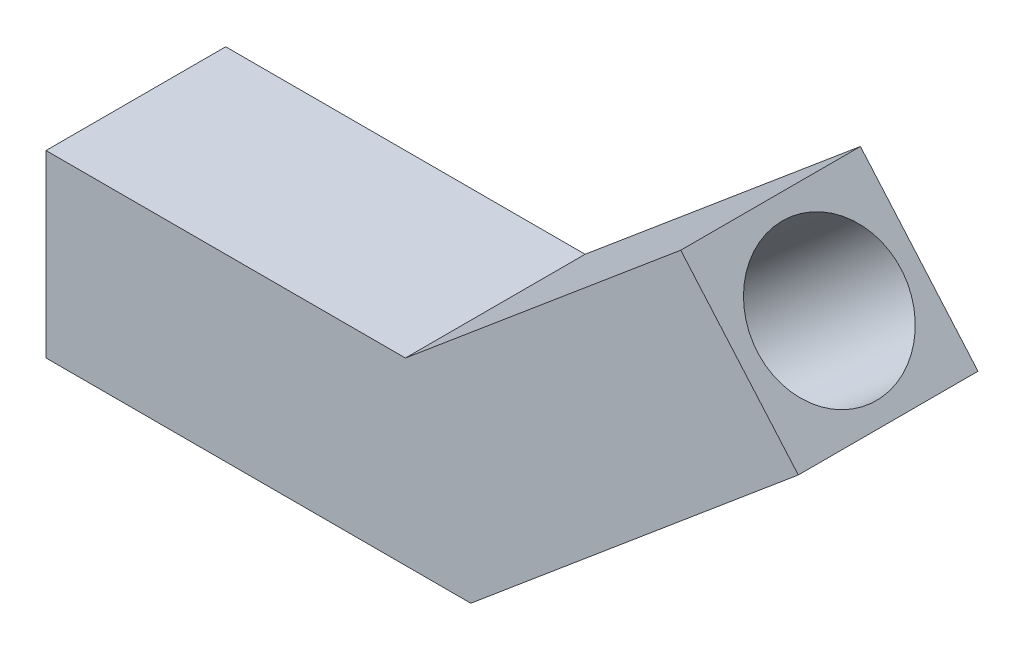
ISO-10303-21;
HEADER;
FILE_DESCRIPTION(('STEP AP214'),'2;1');
FILE_NAME('part.step','',(''),(''),'','','');
FILE_SCHEMA(('AUTOMOTIVE_DESIGN { 1 0 10303 214 1 1 1 1 }'));
ENDSEC;
DATA;
#1=APPLICATION_CONTEXT('core data for automotive mechanical design processes');
#2=APPLICATION_PROTOCOL_DEFINITION('international standard','automotive_design',2000,#1);
#3=PRODUCT_CONTEXT('',#1,'mechanical');
#4=PRODUCT('Part','Part','',(#3));
#5=PRODUCT_RELATED_PRODUCT_CATEGORY('part','',(#4));
#6=PRODUCT_DEFINITION_FORMATION('','',#4);
#7=PRODUCT_DEFINITION_CONTEXT('part definition',#1,'design');
#8=PRODUCT_DEFINITION('design','',#6,#7);
#9=PRODUCT_DEFINITION_SHAPE('','',#8);
#10=(LENGTH_UNIT() NAMED_UNIT(*) SI_UNIT(.MILLI.,.METRE.));
#11=(NAMED_UNIT(*) PLANE_ANGLE_UNIT() SI_UNIT($,.RADIAN.));
#12=(NAMED_UNIT(*) SI_UNIT($,.STERADIAN.) SOLID_ANGLE_UNIT());
#13=UNCERTAINTY_MEASURE_WITH_UNIT(LENGTH_MEASURE(1.E-05),#10,'distance_accuracy_value','');
#14=(GEOMETRIC_REPRESENTATION_CONTEXT(3) GLOBAL_UNCERTAINTY_ASSIGNED_CONTEXT((#13)) GLOBAL_UNIT_ASSIGNED_CONTEXT((#10,
#11,#12)) REPRESENTATION_CONTEXT('',''));
#15=CARTESIAN_POINT('',(0.,0.,0.));
#16=DIRECTION('',(0.,0.,1.));
#17=DIRECTION('',(1.,0.,0.));
#18=AXIS2_PLACEMENT_3D('',#15,#16,#17);
#19=CARTESIAN_POINT('',(-5.,0.,2.5));
#20=DIRECTION('',(1.,0.,0.));
#21=DIRECTION('',(0.,0.,-1.));
#22=AXIS2_PLACEMENT_3D('',#19,#20,#21);
#23=PLANE('',#22);
#24=CARTESIAN_POINT('',(-5.,-1.25,1.25));
#25=DIRECTION('',(-1.,0.,0.));
#26=DIRECTION('',(0.,0.,1.));
#27=AXIS2_PLACEMENT_3D('',#24,#25,#26);
#28=CIRCLE('',#27,1.);
#29=CARTESIAN_POINT('',(-5.,-1.25,2.25));
#30=VERTEX_POINT('',#29);
#31=EDGE_CURVE('E158',#30,#30,#28,.T.);
#32=ORIENTED_EDGE('',*,*,#31,.F.);
#33=EDGE_LOOP('',(#32));
#34=FACE_BOUND('',#33,.T.);
#35=DIRECTION('',(0.,-1.,0.));
#36=VECTOR('',#35,1.);
#37=CARTESIAN_POINT('',(-5.,0.,0.));
#38=LINE('',#37,#36);
#39=CARTESIAN_POINT('',(-5.,0.,0.));
#40=VERTEX_POINT('',#39);
#41=CARTESIAN_POINT('',(-5.,-2.5,0.));
#42=VERTEX_POINT('',#41);
#43=EDGE_CURVE('E116',#40,#42,#38,.T.);
#44=ORIENTED_EDGE('',*,*,#43,.T.);
#45=DIRECTION('',(0.,0.,-1.));
#46=VECTOR('',#45,1.);
#47=CARTESIAN_POINT('',(-5.,-2.5,2.5));
#48=LINE('',#47,#46);
#49=CARTESIAN_POINT('',(-5.,-2.5,2.5));
#50=VERTEX_POINT('',#49);
#51=EDGE_CURVE('E11',#50,#42,#48,.T.);
#52=ORIENTED_EDGE('',*,*,#51,.F.);
#53=DIRECTION('',(0.,-1.,0.));
#54=VECTOR('',#53,1.);
#55=CARTESIAN_POINT('',(-5.,0.,2.5));
#56=LINE('',#55,#54);
#57=CARTESIAN_POINT('',(-5.,0.,2.5));
#58=VERTEX_POINT('',#57);
#59=EDGE_CURVE('E127',#58,#50,#56,.T.);
#60=ORIENTED_EDGE('',*,*,#59,.F.);
#61=DIRECTION('',(0.,0.,-1.));
#62=VECTOR('',#61,1.);
#63=CARTESIAN_POINT('',(-5.,0.,2.5));
#64=LINE('',#63,#62);
#65=EDGE_CURVE('E112',#58,#40,#64,.T.);
#66=ORIENTED_EDGE('',*,*,#65,.T.);
#67=EDGE_LOOP('',(#44,#52,#60,#66));
#68=FACE_BOUND('',#67,.T.);
#69=ADVANCED_FACE('F32',(#34,#68),#23,.F.);
#70=CARTESIAN_POINT('',(-5.,-2.5,2.5));
#71=DIRECTION('',(0.,1.,0.));
#72=DIRECTION('',(0.,0.,1.));
#73=AXIS2_PLACEMENT_3D('',#70,#71,#72);
#74=PLANE('',#73);
#75=DIRECTION('',(1.,0.,0.));
#76=VECTOR('',#75,1.);
#77=CARTESIAN_POINT('',(-5.,-2.5,0.));
#78=LINE('',#77,#76);
#79=CARTESIAN_POINT('',(0.909480398793596,-2.5,0.));
#80=VERTEX_POINT('',#79);
#81=EDGE_CURVE('E119',#42,#80,#78,.T.);
#82=ORIENTED_EDGE('',*,*,#81,.T.);
#83=DIRECTION('',(0.,0.,-1.));
#84=VECTOR('',#83,1.);
#85=CARTESIAN_POINT('',(0.909480398793596,-2.5,2.5));
#86=LINE('',#85,#84);
#87=CARTESIAN_POINT('',(0.909480398793596,-2.5,2.5));
#88=VERTEX_POINT('',#87);
#89=EDGE_CURVE('E40',#88,#80,#86,.T.);
#90=ORIENTED_EDGE('',*,*,#89,.F.);
#91=DIRECTION('',(1.,0.,0.));
#92=VECTOR('',#91,1.);
#93=CARTESIAN_POINT('',(-5.,-2.5,2.5));
#94=LINE('',#93,#92);
#95=EDGE_CURVE('E85',#50,#88,#94,.T.);
#96=ORIENTED_EDGE('',*,*,#95,.F.);
#97=ORIENTED_EDGE('',*,*,#51,.T.);
#98=EDGE_LOOP('',(#82,#90,#96,#97));
#99=FACE_BOUND('',#98,.T.);
#100=ADVANCED_FACE('F151',(#99),#74,.F.);
#101=CARTESIAN_POINT('',(0.909480398793596,-2.5,2.5));
#102=DIRECTION('',(-0.64278760968654,0.766044443118977,0.));
#103=DIRECTION('',(-0.766044443118977,-0.64278760968654,0.));
#104=AXIS2_PLACEMENT_3D('',#101,#102,#103);
#105=PLANE('',#104);
#106=DIRECTION('',(0.766044443118977,0.64278760968654,0.));
#107=VECTOR('',#106,1.);
#108=CARTESIAN_POINT('',(0.909480398793596,-2.5,0.));
#109=LINE('',#108,#107);
#110=CARTESIAN_POINT('',(5.46598283431779,1.32335951310674,0.));
#111=VERTEX_POINT('',#110);
#112=EDGE_CURVE('E122',#80,#111,#109,.T.);
#113=ORIENTED_EDGE('',*,*,#112,.T.);
#114=DIRECTION('',(0.,0.,-1.));
#115=VECTOR('',#114,1.);
#116=CARTESIAN_POINT('',(5.46598283431779,1.32335951310674,2.5));
#117=LINE('',#116,#115);
#118=CARTESIAN_POINT('',(5.46598283431779,1.32335951310674,2.5));
#119=VERTEX_POINT('',#118);
#120=EDGE_CURVE('E107',#119,#111,#117,.T.);
#121=ORIENTED_EDGE('',*,*,#120,.F.);
#122=DIRECTION('',(0.766044443118977,0.64278760968654,0.));
#123=VECTOR('',#122,1.);
#124=CARTESIAN_POINT('',(0.909480398793596,-2.5,2.5));
#125=LINE('',#124,#123);
#126=EDGE_CURVE('E98',#88,#119,#125,.T.);
#127=ORIENTED_EDGE('',*,*,#126,.F.);
#128=ORIENTED_EDGE('',*,*,#89,.T.);
#129=EDGE_LOOP('',(#113,#121,#127,#128));
#130=FACE_BOUND('',#129,.T.);
#131=ADVANCED_FACE('F133',(#130),#105,.F.);
#132=CARTESIAN_POINT('',(5.46598283431779,1.32335951310674,2.5));
#133=DIRECTION('',(-0.756231414130386,-0.65430424748916,0.));
#134=DIRECTION('',(0.65430424748916,-0.756231414130386,0.));
#135=AXIS2_PLACEMENT_3D('',#132,#133,#134);
#136=PLANE('',#135);
#137=CARTESIAN_POINT('',(4.64810252495634,2.26864878076972,1.25));
#138=DIRECTION('',(0.756231414130386,0.654304247489161,0.));
#139=DIRECTION('',(-0.654304247489161,0.756231414130386,0.));
#140=AXIS2_PLACEMENT_3D('',#137,#138,#139);
#141=CIRCLE('',#140,1.);
#142=CARTESIAN_POINT('',(3.99379827746718,3.02488019490011,1.25));
#143=VERTEX_POINT('',#142);
#144=EDGE_CURVE('E163',#143,#143,#141,.T.);
#145=ORIENTED_EDGE('',*,*,#144,.F.);
#146=EDGE_LOOP('',(#145));
#147=FACE_BOUND('',#146,.T.);
#148=DIRECTION('',(-0.65430424748916,0.756231414130386,0.));
#149=VECTOR('',#148,1.);
#150=CARTESIAN_POINT('',(5.46598283431779,1.32335951310674,0.));
#151=LINE('',#150,#149);
#152=CARTESIAN_POINT('',(3.83022221559489,3.2139380484327,0.));
#153=VERTEX_POINT('',#152);
#154=EDGE_CURVE('E106',#111,#153,#151,.T.);
#155=ORIENTED_EDGE('',*,*,#154,.T.);
#156=DIRECTION('',(0.,0.,-1.));
#157=VECTOR('',#156,1.);
#158=CARTESIAN_POINT('',(3.83022221559489,3.2139380484327,2.5));
#159=LINE('',#158,#157);
#160=CARTESIAN_POINT('',(3.83022221559489,3.2139380484327,2.5));
#161=VERTEX_POINT('',#160);
#162=EDGE_CURVE('E103',#161,#153,#159,.T.);
#163=ORIENTED_EDGE('',*,*,#162,.F.);
#164=DIRECTION('',(-0.65430424748916,0.756231414130386,0.));
#165=VECTOR('',#164,1.);
#166=CARTESIAN_POINT('',(5.46598283431779,1.32335951310674,2.5));
#167=LINE('',#166,#165);
#168=EDGE_CURVE('E92',#119,#161,#167,.T.);
#169=ORIENTED_EDGE('',*,*,#168,.F.);
#170=ORIENTED_EDGE('',*,*,#120,.T.);
#171=EDGE_LOOP('',(#155,#163,#169,#170));
#172=FACE_BOUND('',#171,.T.);
#173=ADVANCED_FACE('F104',(#147,#172),#136,.F.);
#174=CARTESIAN_POINT('',(0.,0.,2.5));
#175=DIRECTION('',(0.64278760968654,-0.766044443118977,0.));
#176=DIRECTION('',(0.766044443118977,0.64278760968654,0.));
#177=AXIS2_PLACEMENT_3D('',#174,#175,#176);
#178=PLANE('',#177);
#179=DIRECTION('',(-0.766044443118977,-0.64278760968654,0.));
#180=VECTOR('',#179,1.);
#181=CARTESIAN_POINT('',(0.,0.,0.));
#182=LINE('',#181,#180);
#183=CARTESIAN_POINT('',(0.,0.,0.));
#184=VERTEX_POINT('',#183);
#185=EDGE_CURVE('E71',#153,#184,#182,.T.);
#186=ORIENTED_EDGE('',*,*,#185,.T.);
#187=DIRECTION('',(0.,0.,-1.));
#188=VECTOR('',#187,1.);
#189=CARTESIAN_POINT('',(0.,0.,2.5));
#190=LINE('',#189,#188);
#191=CARTESIAN_POINT('',(0.,0.,2.5));
#192=VERTEX_POINT('',#191);
#193=EDGE_CURVE('E108',#192,#184,#190,.T.);
#194=ORIENTED_EDGE('',*,*,#193,.F.);
#195=DIRECTION('',(-0.766044443118977,-0.64278760968654,0.));
#196=VECTOR('',#195,1.);
#197=CARTESIAN_POINT('',(0.,0.,2.5));
#198=LINE('',#197,#196);
#199=EDGE_CURVE('E96',#161,#192,#198,.T.);
#200=ORIENTED_EDGE('',*,*,#199,.F.);
#201=ORIENTED_EDGE('',*,*,#162,.T.);
#202=EDGE_LOOP('',(#186,#194,#200,#201));
#203=FACE_BOUND('',#202,.T.);
#204=ADVANCED_FACE('F110',(#203),#178,.F.);
#205=CARTESIAN_POINT('',(-5.,0.,2.5));
#206=DIRECTION('',(0.,-1.,0.));
#207=DIRECTION('',(0.,0.,-1.));
#208=AXIS2_PLACEMENT_3D('',#205,#206,#207);
#209=PLANE('',#208);
#210=DIRECTION('',(-1.,0.,0.));
#211=VECTOR('',#210,1.);
#212=CARTESIAN_POINT('',(-5.,0.,0.));
#213=LINE('',#212,#211);
#214=EDGE_CURVE('E77',#184,#40,#213,.T.);
#215=ORIENTED_EDGE('',*,*,#214,.T.);
#216=ORIENTED_EDGE('',*,*,#65,.F.);
#217=DIRECTION('',(-1.,0.,0.));
#218=VECTOR('',#217,1.);
#219=CARTESIAN_POINT('',(-5.,0.,2.5));
#220=LINE('',#219,#218);
#221=EDGE_CURVE('E48',#192,#58,#220,.T.);
#222=ORIENTED_EDGE('',*,*,#221,.F.);
#223=ORIENTED_EDGE('',*,*,#193,.T.);
#224=EDGE_LOOP('',(#215,#216,#222,#223));
#225=FACE_BOUND('',#224,.T.);
#226=ADVANCED_FACE('F140',(#225),#209,.F.);
#227=CARTESIAN_POINT('',(0.,0.,2.5));
#228=DIRECTION('',(0.,0.,1.));
#229=DIRECTION('',(1.,0.,0.));
#230=AXIS2_PLACEMENT_3D('',#227,#228,#229);
#231=PLANE('',#230);
#232=ORIENTED_EDGE('',*,*,#59,.T.);
#233=ORIENTED_EDGE('',*,*,#95,.T.);
#234=ORIENTED_EDGE('',*,*,#126,.T.);
#235=ORIENTED_EDGE('',*,*,#168,.T.);
#236=ORIENTED_EDGE('',*,*,#199,.T.);
#237=ORIENTED_EDGE('',*,*,#221,.T.);
#238=EDGE_LOOP('',(#232,#233,#234,#235,#236,#237));
#239=FACE_BOUND('',#238,.T.);
#240=ADVANCED_FACE('F94',(#239),#231,.T.);
#241=CARTESIAN_POINT('',(0.,0.,0.));
#242=DIRECTION('',(0.,0.,1.));
#243=DIRECTION('',(1.,0.,0.));
#244=AXIS2_PLACEMENT_3D('',#241,#242,#243);
#245=PLANE('',#244);
#246=ORIENTED_EDGE('',*,*,#43,.F.);
#247=ORIENTED_EDGE('',*,*,#214,.F.);
#248=ORIENTED_EDGE('',*,*,#185,.F.);
#249=ORIENTED_EDGE('',*,*,#154,.F.);
#250=ORIENTED_EDGE('',*,*,#112,.F.);
#251=ORIENTED_EDGE('',*,*,#81,.F.);
#252=EDGE_LOOP('',(#246,#247,#248,#249,#250,#251));
#253=FACE_BOUND('',#252,.T.);
#254=ADVANCED_FACE('F136',(#253),#245,.F.);
#255=CARTESIAN_POINT('',(0.866945454304409,-1.00287245667608,1.25));
#256=DIRECTION('',(0.756231414130386,0.654304247489161,0.));
#257=DIRECTION('',(-0.654304247489161,0.756231414130386,0.));
#258=AXIS2_PLACEMENT_3D('',#255,#256,#257);
#259=CYLINDRICAL_SURFACE('',#258,1.);
#260=CARTESIAN_POINT('',(0.866945454304409,-1.00287245667608,1.25));
#261=DIRECTION('',(0.756231414130386,0.654304247489161,0.));
#262=DIRECTION('',(-0.654304247489161,0.756231414130386,0.));
#263=AXIS2_PLACEMENT_3D('',#260,#261,#262);
#264=CIRCLE('',#263,1.);
#265=CARTESIAN_POINT('',(0.212641206815248,-0.246641042545698,1.25));
#266=VERTEX_POINT('',#265);
#267=EDGE_CURVE('E120',#266,#266,#264,.T.);
#268=ORIENTED_EDGE('',*,*,#267,.F.);
#269=EDGE_LOOP('',(#268));
#270=FACE_BOUND('',#269,.T.);
#271=ORIENTED_EDGE('',*,*,#144,.T.);
#272=EDGE_LOOP('',(#271));
#273=FACE_BOUND('',#272,.T.);
#274=ADVANCED_FACE('F173',(#270,#273),#259,.F.);
#275=CARTESIAN_POINT('',(0.866945454304409,-1.00287245667608,1.25));
#276=DIRECTION('',(0.756231414130386,0.654304247489161,0.));
#277=DIRECTION('',(-0.654304247489161,0.756231414130386,0.));
#278=AXIS2_PLACEMENT_3D('',#275,#276,#277);
#279=PLANE('',#278);
#280=ORIENTED_EDGE('',*,*,#267,.T.);
#281=EDGE_LOOP('',(#280));
#282=FACE_BOUND('',#281,.T.);
#283=ADVANCED_FACE('F226',(#282),#279,.T.);
#284=CARTESIAN_POINT('',(0.,-1.25,1.25));
#285=DIRECTION('',(-1.,0.,0.));
#286=DIRECTION('',(0.,0.,1.));
#287=AXIS2_PLACEMENT_3D('',#284,#285,#286);
#288=CYLINDRICAL_SURFACE('',#287,1.);
#289=CARTESIAN_POINT('',(0.,-1.25,1.25));
#290=DIRECTION('',(-1.,0.,0.));
#291=DIRECTION('',(0.,0.,1.));
#292=AXIS2_PLACEMENT_3D('',#289,#290,#291);
#293=CIRCLE('',#292,1.);
#294=CARTESIAN_POINT('',(0.,-1.25,2.25));
#295=VERTEX_POINT('',#294);
#296=EDGE_CURVE('E160',#295,#295,#293,.T.);
#297=ORIENTED_EDGE('',*,*,#296,.F.);
#298=EDGE_LOOP('',(#297));
#299=FACE_BOUND('',#298,.T.);
#300=ORIENTED_EDGE('',*,*,#31,.T.);
#301=EDGE_LOOP('',(#300));
#302=FACE_BOUND('',#301,.T.);
#303=ADVANCED_FACE('F235',(#299,#302),#288,.F.);
#304=CARTESIAN_POINT('',(0.,-1.25,1.25));
#305=DIRECTION('',(-1.,0.,0.));
#306=DIRECTION('',(0.,0.,1.));
#307=AXIS2_PLACEMENT_3D('',#304,#305,#306);
#308=PLANE('',#307);
#309=ORIENTED_EDGE('',*,*,#296,.T.);
#310=EDGE_LOOP('',(#309));
#311=FACE_BOUND('',#310,.T.);
#312=ADVANCED_FACE('F244',(#311),#308,.T.);
#313=CLOSED_SHELL('',(#69,#100,#131,#173,#204,#226,#240,#254,#274,#283,#303,#312));
#314=MANIFOLD_SOLID_BREP('B2',#313);
#315=ADVANCED_BREP_SHAPE_REPRESENTATION('',(#18,#314),#14);
#316=SHAPE_DEFINITION_REPRESENTATION(#9,#315);
ENDSEC;
END-ISO-10303-21;
